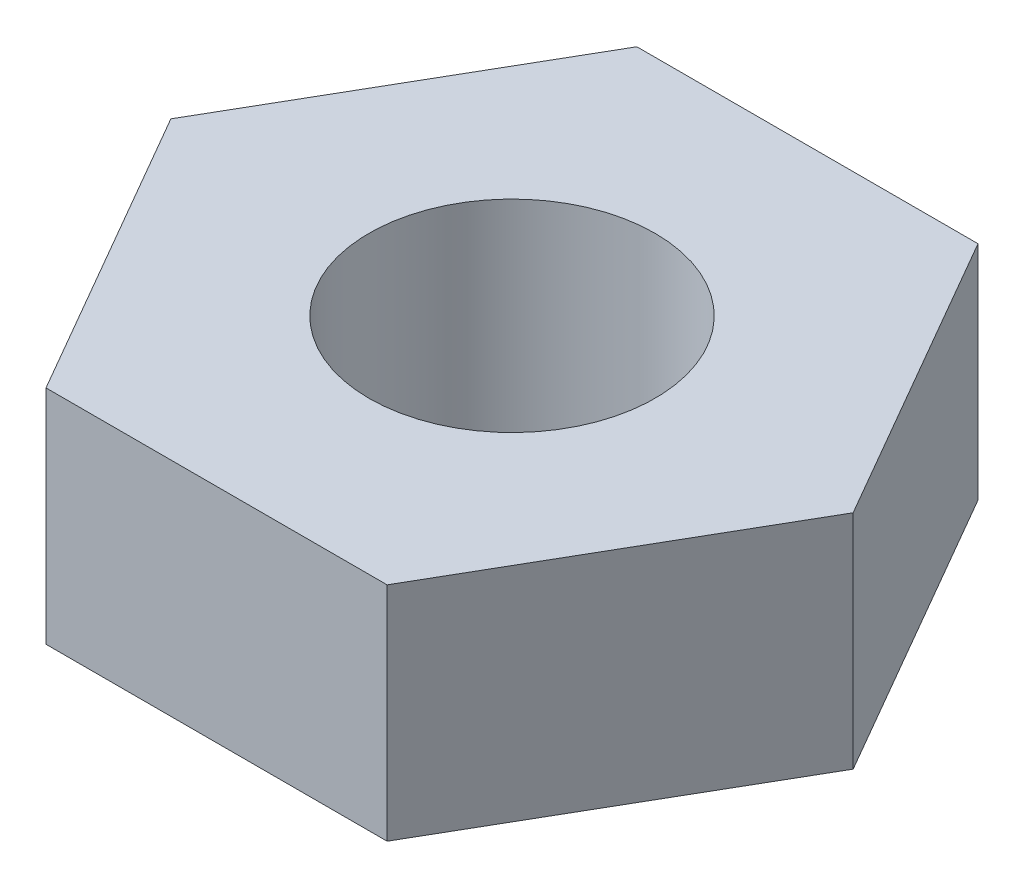
ISO-10303-21;
HEADER;
FILE_DESCRIPTION(('STEP AP214'),'2;1');
FILE_NAME('part.step','',(''),(''),'','','');
FILE_SCHEMA(('AUTOMOTIVE_DESIGN { 1 0 10303 214 1 1 1 1 }'));
ENDSEC;
DATA;
#1=APPLICATION_CONTEXT('core data for automotive mechanical design processes');
#2=APPLICATION_PROTOCOL_DEFINITION('international standard','automotive_design',2000,#1);
#3=PRODUCT_CONTEXT('',#1,'mechanical');
#4=PRODUCT('Part','Part','',(#3));
#5=PRODUCT_RELATED_PRODUCT_CATEGORY('part','',(#4));
#6=PRODUCT_DEFINITION_FORMATION('','',#4);
#7=PRODUCT_DEFINITION_CONTEXT('part definition',#1,'design');
#8=PRODUCT_DEFINITION('design','',#6,#7);
#9=PRODUCT_DEFINITION_SHAPE('','',#8);
#10=(LENGTH_UNIT() NAMED_UNIT(*) SI_UNIT(.MILLI.,.METRE.));
#11=(NAMED_UNIT(*) PLANE_ANGLE_UNIT() SI_UNIT($,.RADIAN.));
#12=(NAMED_UNIT(*) SI_UNIT($,.STERADIAN.) SOLID_ANGLE_UNIT());
#13=UNCERTAINTY_MEASURE_WITH_UNIT(LENGTH_MEASURE(1.E-05),#10,'distance_accuracy_value','');
#14=(GEOMETRIC_REPRESENTATION_CONTEXT(3) GLOBAL_UNCERTAINTY_ASSIGNED_CONTEXT((#13)) GLOBAL_UNIT_ASSIGNED_CONTEXT((#10,
#11,#12)) REPRESENTATION_CONTEXT('',''));
#15=CARTESIAN_POINT('',(0.,0.,0.));
#16=DIRECTION('',(0.,0.,1.));
#17=DIRECTION('',(1.,0.,0.));
#18=AXIS2_PLACEMENT_3D('',#15,#16,#17);
#19=CARTESIAN_POINT('',(0.906439922627732,1.18,1.56999999999999));
#20=DIRECTION('',(-0.866025403784441,0.,-0.499999999999995));
#21=DIRECTION('',(-0.499999999999995,0.,0.866025403784442));
#22=AXIS2_PLACEMENT_3D('',#19,#20,#21);
#23=PLANE('',#22);
#24=DIRECTION('',(0.499999999999995,0.,-0.866025403784442));
#25=VECTOR('',#24,1.);
#26=CARTESIAN_POINT('',(0.906439922627732,0.,1.56999999999999));
#27=LINE('',#26,#25);
#28=CARTESIAN_POINT('',(0.906439922627732,0.,1.56999999999999));
#29=VERTEX_POINT('',#28);
#30=CARTESIAN_POINT('',(1.81287984525543,0.,0.));
#31=VERTEX_POINT('',#30);
#32=EDGE_CURVE('E128',#29,#31,#27,.T.);
#33=ORIENTED_EDGE('',*,*,#32,.T.);
#34=DIRECTION('',(0.,-1.,0.));
#35=VECTOR('',#34,1.);
#36=CARTESIAN_POINT('',(1.81287984525543,1.18,0.));
#37=LINE('',#36,#35);
#38=CARTESIAN_POINT('',(1.81287984525543,1.18,0.));
#39=VERTEX_POINT('',#38);
#40=EDGE_CURVE('E11',#39,#31,#37,.T.);
#41=ORIENTED_EDGE('',*,*,#40,.F.);
#42=DIRECTION('',(0.499999999999995,0.,-0.866025403784442));
#43=VECTOR('',#42,1.);
#44=CARTESIAN_POINT('',(0.906439922627732,1.18,1.56999999999999));
#45=LINE('',#44,#43);
#46=CARTESIAN_POINT('',(0.906439922627732,1.18,1.56999999999999));
#47=VERTEX_POINT('',#46);
#48=EDGE_CURVE('E145',#47,#39,#45,.T.);
#49=ORIENTED_EDGE('',*,*,#48,.F.);
#50=DIRECTION('',(0.,-1.,0.));
#51=VECTOR('',#50,1.);
#52=CARTESIAN_POINT('',(0.906439922627732,1.18,1.56999999999999));
#53=LINE('',#52,#51);
#54=EDGE_CURVE('E124',#47,#29,#53,.T.);
#55=ORIENTED_EDGE('',*,*,#54,.T.);
#56=EDGE_LOOP('',(#33,#41,#49,#55));
#57=FACE_BOUND('',#56,.T.);
#58=ADVANCED_FACE('F39',(#57),#23,.F.);
#59=CARTESIAN_POINT('',(1.81287984525543,1.18,0.));
#60=DIRECTION('',(-0.866025403784438,0.,0.500000000000001));
#61=DIRECTION('',(0.500000000000001,0.,0.866025403784438));
#62=AXIS2_PLACEMENT_3D('',#59,#60,#61);
#63=PLANE('',#62);
#64=DIRECTION('',(-0.500000000000001,0.,-0.866025403784438));
#65=VECTOR('',#64,1.);
#66=CARTESIAN_POINT('',(1.81287984525543,0.,0.));
#67=LINE('',#66,#65);
#68=CARTESIAN_POINT('',(0.90643992262771,0.,-1.57));
#69=VERTEX_POINT('',#68);
#70=EDGE_CURVE('E132',#31,#69,#67,.T.);
#71=ORIENTED_EDGE('',*,*,#70,.T.);
#72=DIRECTION('',(0.,-1.,0.));
#73=VECTOR('',#72,1.);
#74=CARTESIAN_POINT('',(0.90643992262771,1.18,-1.57));
#75=LINE('',#74,#73);
#76=CARTESIAN_POINT('',(0.90643992262771,1.18,-1.57));
#77=VERTEX_POINT('',#76);
#78=EDGE_CURVE('E48',#77,#69,#75,.T.);
#79=ORIENTED_EDGE('',*,*,#78,.F.);
#80=DIRECTION('',(-0.500000000000001,0.,-0.866025403784438));
#81=VECTOR('',#80,1.);
#82=CARTESIAN_POINT('',(1.81287984525543,1.18,0.));
#83=LINE('',#82,#81);
#84=EDGE_CURVE('E93',#39,#77,#83,.T.);
#85=ORIENTED_EDGE('',*,*,#84,.F.);
#86=ORIENTED_EDGE('',*,*,#40,.T.);
#87=EDGE_LOOP('',(#71,#79,#85,#86));
#88=FACE_BOUND('',#87,.T.);
#89=ADVANCED_FACE('F174',(#88),#63,.F.);
#90=CARTESIAN_POINT('',(0.90643992262771,1.18,-1.57));
#91=DIRECTION('',(0.,0.,1.));
#92=DIRECTION('',(1.,0.,0.));
#93=AXIS2_PLACEMENT_3D('',#90,#91,#92);
#94=PLANE('',#93);
#95=DIRECTION('',(-1.,0.,0.));
#96=VECTOR('',#95,1.);
#97=CARTESIAN_POINT('',(0.90643992262771,0.,-1.57));
#98=LINE('',#97,#96);
#99=CARTESIAN_POINT('',(-0.906439922627721,0.,-1.57));
#100=VERTEX_POINT('',#99);
#101=EDGE_CURVE('E136',#69,#100,#98,.T.);
#102=ORIENTED_EDGE('',*,*,#101,.T.);
#103=DIRECTION('',(0.,-1.,0.));
#104=VECTOR('',#103,1.);
#105=CARTESIAN_POINT('',(-0.906439922627721,1.18,-1.57));
#106=LINE('',#105,#104);
#107=CARTESIAN_POINT('',(-0.906439922627721,1.18,-1.57));
#108=VERTEX_POINT('',#107);
#109=EDGE_CURVE('E117',#108,#100,#106,.T.);
#110=ORIENTED_EDGE('',*,*,#109,.F.);
#111=DIRECTION('',(-1.,0.,0.));
#112=VECTOR('',#111,1.);
#113=CARTESIAN_POINT('',(0.90643992262771,1.18,-1.57));
#114=LINE('',#113,#112);
#115=EDGE_CURVE('E106',#77,#108,#114,.T.);
#116=ORIENTED_EDGE('',*,*,#115,.F.);
#117=ORIENTED_EDGE('',*,*,#78,.T.);
#118=EDGE_LOOP('',(#102,#110,#116,#117));
#119=FACE_BOUND('',#118,.T.);
#120=ADVANCED_FACE('F155',(#119),#94,.F.);
#121=CARTESIAN_POINT('',(-0.906439922627721,1.18,-1.57));
#122=DIRECTION('',(0.866025403784442,0.,0.499999999999995));
#123=DIRECTION('',(0.499999999999995,0.,-0.866025403784442));
#124=AXIS2_PLACEMENT_3D('',#121,#122,#123);
#125=PLANE('',#124);
#126=DIRECTION('',(-0.499999999999995,0.,0.866025403784442));
#127=VECTOR('',#126,1.);
#128=CARTESIAN_POINT('',(-0.906439922627721,0.,-1.57));
#129=LINE('',#128,#127);
#130=CARTESIAN_POINT('',(-1.81287984525543,0.,0.));
#131=VERTEX_POINT('',#130);
#132=EDGE_CURVE('E115',#100,#131,#129,.T.);
#133=ORIENTED_EDGE('',*,*,#132,.T.);
#134=DIRECTION('',(0.,-1.,0.));
#135=VECTOR('',#134,1.);
#136=CARTESIAN_POINT('',(-1.81287984525543,1.18,0.));
#137=LINE('',#136,#135);
#138=CARTESIAN_POINT('',(-1.81287984525543,1.18,0.));
#139=VERTEX_POINT('',#138);
#140=EDGE_CURVE('E112',#139,#131,#137,.T.);
#141=ORIENTED_EDGE('',*,*,#140,.F.);
#142=DIRECTION('',(-0.499999999999995,0.,0.866025403784442));
#143=VECTOR('',#142,1.);
#144=CARTESIAN_POINT('',(-0.906439922627721,1.18,-1.57));
#145=LINE('',#144,#143);
#146=EDGE_CURVE('E100',#108,#139,#145,.T.);
#147=ORIENTED_EDGE('',*,*,#146,.F.);
#148=ORIENTED_EDGE('',*,*,#109,.T.);
#149=EDGE_LOOP('',(#133,#141,#147,#148));
#150=FACE_BOUND('',#149,.T.);
#151=ADVANCED_FACE('F113',(#150),#125,.F.);
#152=CARTESIAN_POINT('',(-1.81287984525543,1.18,0.));
#153=DIRECTION('',(0.866025403784435,0.,-0.500000000000007));
#154=DIRECTION('',(-0.500000000000007,0.,-0.866025403784435));
#155=AXIS2_PLACEMENT_3D('',#152,#153,#154);
#156=PLANE('',#155);
#157=DIRECTION('',(0.500000000000007,0.,0.866025403784435));
#158=VECTOR('',#157,1.);
#159=CARTESIAN_POINT('',(-1.81287984525543,0.,0.));
#160=LINE('',#159,#158);
#161=CARTESIAN_POINT('',(-0.906439922627699,0.,1.57000000000001));
#162=VERTEX_POINT('',#161);
#163=EDGE_CURVE('E79',#131,#162,#160,.T.);
#164=ORIENTED_EDGE('',*,*,#163,.T.);
#165=DIRECTION('',(0.,-1.,0.));
#166=VECTOR('',#165,1.);
#167=CARTESIAN_POINT('',(-0.906439922627699,1.18,1.57000000000001));
#168=LINE('',#167,#166);
#169=CARTESIAN_POINT('',(-0.906439922627699,1.18,1.57000000000001));
#170=VERTEX_POINT('',#169);
#171=EDGE_CURVE('E118',#170,#162,#168,.T.);
#172=ORIENTED_EDGE('',*,*,#171,.F.);
#173=DIRECTION('',(0.500000000000007,0.,0.866025403784435));
#174=VECTOR('',#173,1.);
#175=CARTESIAN_POINT('',(-1.81287984525543,1.18,0.));
#176=LINE('',#175,#174);
#177=EDGE_CURVE('E104',#139,#170,#176,.T.);
#178=ORIENTED_EDGE('',*,*,#177,.F.);
#179=ORIENTED_EDGE('',*,*,#140,.T.);
#180=EDGE_LOOP('',(#164,#172,#178,#179));
#181=FACE_BOUND('',#180,.T.);
#182=ADVANCED_FACE('F120',(#181),#156,.F.);
#183=CARTESIAN_POINT('',(-0.906439922627699,1.18,1.57000000000001));
#184=DIRECTION('',(0.,0.,-1.));
#185=DIRECTION('',(-1.,0.,0.));
#186=AXIS2_PLACEMENT_3D('',#183,#184,#185);
#187=PLANE('',#186);
#188=DIRECTION('',(1.,0.,0.));
#189=VECTOR('',#188,1.);
#190=CARTESIAN_POINT('',(-0.906439922627699,0.,1.57000000000001));
#191=LINE('',#190,#189);
#192=EDGE_CURVE('E85',#162,#29,#191,.T.);
#193=ORIENTED_EDGE('',*,*,#192,.T.);
#194=ORIENTED_EDGE('',*,*,#54,.F.);
#195=DIRECTION('',(1.,0.,0.));
#196=VECTOR('',#195,1.);
#197=CARTESIAN_POINT('',(-0.906439922627699,1.18,1.57000000000001));
#198=LINE('',#197,#196);
#199=EDGE_CURVE('E56',#170,#47,#198,.T.);
#200=ORIENTED_EDGE('',*,*,#199,.F.);
#201=ORIENTED_EDGE('',*,*,#171,.T.);
#202=EDGE_LOOP('',(#193,#194,#200,#201));
#203=FACE_BOUND('',#202,.T.);
#204=ADVANCED_FACE('F162',(#203),#187,.F.);
#205=CARTESIAN_POINT('',(0.,1.18,0.));
#206=DIRECTION('',(0.,1.,0.));
#207=DIRECTION('',(0.,0.,1.));
#208=AXIS2_PLACEMENT_3D('',#205,#206,#207);
#209=PLANE('',#208);
#210=CARTESIAN_POINT('',(0.,1.18,0.));
#211=DIRECTION('',(0.,1.,0.));
#212=DIRECTION('',(0.,0.,1.));
#213=AXIS2_PLACEMENT_3D('',#210,#211,#212);
#214=CIRCLE('',#213,0.76);
#215=CARTESIAN_POINT('',(0.,1.18,0.76));
#216=VERTEX_POINT('',#215);
#217=EDGE_CURVE('E229',#216,#216,#214,.T.);
#218=ORIENTED_EDGE('',*,*,#217,.F.);
#219=EDGE_LOOP('',(#218));
#220=FACE_BOUND('',#219,.T.);
#221=ORIENTED_EDGE('',*,*,#48,.T.);
#222=ORIENTED_EDGE('',*,*,#84,.T.);
#223=ORIENTED_EDGE('',*,*,#115,.T.);
#224=ORIENTED_EDGE('',*,*,#146,.T.);
#225=ORIENTED_EDGE('',*,*,#177,.T.);
#226=ORIENTED_EDGE('',*,*,#199,.T.);
#227=EDGE_LOOP('',(#221,#222,#223,#224,#225,#226));
#228=FACE_BOUND('',#227,.T.);
#229=ADVANCED_FACE('F102',(#220,#228),#209,.T.);
#230=CARTESIAN_POINT('',(0.,0.,0.));
#231=DIRECTION('',(0.,1.,0.));
#232=DIRECTION('',(0.,0.,1.));
#233=AXIS2_PLACEMENT_3D('',#230,#231,#232);
#234=PLANE('',#233);
#235=CARTESIAN_POINT('',(0.,0.,0.));
#236=DIRECTION('',(0.,1.,0.));
#237=DIRECTION('',(0.,0.,1.));
#238=AXIS2_PLACEMENT_3D('',#235,#236,#237);
#239=CIRCLE('',#238,0.76);
#240=CARTESIAN_POINT('',(0.,0.,0.76));
#241=VERTEX_POINT('',#240);
#242=EDGE_CURVE('E133',#241,#241,#239,.T.);
#243=ORIENTED_EDGE('',*,*,#242,.T.);
#244=EDGE_LOOP('',(#243));
#245=FACE_BOUND('',#244,.T.);
#246=ORIENTED_EDGE('',*,*,#32,.F.);
#247=ORIENTED_EDGE('',*,*,#192,.F.);
#248=ORIENTED_EDGE('',*,*,#163,.F.);
#249=ORIENTED_EDGE('',*,*,#132,.F.);
#250=ORIENTED_EDGE('',*,*,#101,.F.);
#251=ORIENTED_EDGE('',*,*,#70,.F.);
#252=EDGE_LOOP('',(#246,#247,#248,#249,#250,#251));
#253=FACE_BOUND('',#252,.T.);
#254=ADVANCED_FACE('F158',(#245,#253),#234,.F.);
#255=CARTESIAN_POINT('',(0.,0.,0.));
#256=DIRECTION('',(0.,1.,0.));
#257=DIRECTION('',(0.,0.,1.));
#258=AXIS2_PLACEMENT_3D('',#255,#256,#257);
#259=CYLINDRICAL_SURFACE('',#258,0.76);
#260=ORIENTED_EDGE('',*,*,#242,.F.);
#261=EDGE_LOOP('',(#260));
#262=FACE_BOUND('',#261,.T.);
#263=ORIENTED_EDGE('',*,*,#217,.T.);
#264=EDGE_LOOP('',(#263));
#265=FACE_BOUND('',#264,.T.);
#266=ADVANCED_FACE('F211',(#262,#265),#259,.F.);
#267=CLOSED_SHELL('',(#58,#89,#120,#151,#182,#204,#229,#254,#266));
#268=MANIFOLD_SOLID_BREP('B2',#267);
#269=ADVANCED_BREP_SHAPE_REPRESENTATION('',(#18,#268),#14);
#270=SHAPE_DEFINITION_REPRESENTATION(#9,#269);
ENDSEC;
END-ISO-10303-21;
